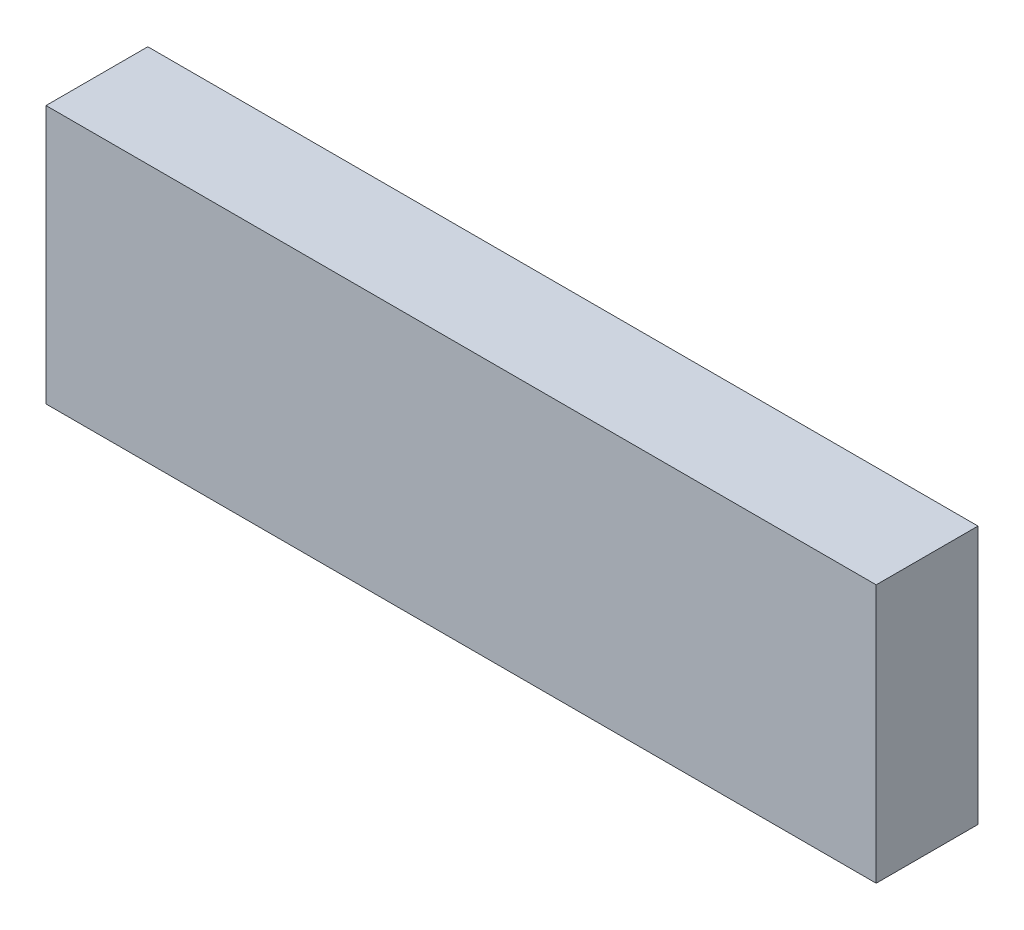
ISO-10303-21;
HEADER;
FILE_DESCRIPTION(('STEP AP214'),'2;1');
FILE_NAME('part.step','',(''),(''),'','','');
FILE_SCHEMA(('AUTOMOTIVE_DESIGN { 1 0 10303 214 1 1 1 1 }'));
ENDSEC;
DATA;
#1=APPLICATION_CONTEXT('core data for automotive mechanical design processes');
#2=APPLICATION_PROTOCOL_DEFINITION('international standard','automotive_design',2000,#1);
#3=PRODUCT_CONTEXT('',#1,'mechanical');
#4=PRODUCT('Part','Part','',(#3));
#5=PRODUCT_RELATED_PRODUCT_CATEGORY('part','',(#4));
#6=PRODUCT_DEFINITION_FORMATION('','',#4);
#7=PRODUCT_DEFINITION_CONTEXT('part definition',#1,'design');
#8=PRODUCT_DEFINITION('design','',#6,#7);
#9=PRODUCT_DEFINITION_SHAPE('','',#8);
#10=(LENGTH_UNIT() NAMED_UNIT(*) SI_UNIT(.MILLI.,.METRE.));
#11=(NAMED_UNIT(*) PLANE_ANGLE_UNIT() SI_UNIT($,.RADIAN.));
#12=(NAMED_UNIT(*) SI_UNIT($,.STERADIAN.) SOLID_ANGLE_UNIT());
#13=UNCERTAINTY_MEASURE_WITH_UNIT(LENGTH_MEASURE(1.E-05),#10,'distance_accuracy_value','');
#14=(GEOMETRIC_REPRESENTATION_CONTEXT(3) GLOBAL_UNCERTAINTY_ASSIGNED_CONTEXT((#13)) GLOBAL_UNIT_ASSIGNED_CONTEXT((#10,
#11,#12)) REPRESENTATION_CONTEXT('',''));
#15=CARTESIAN_POINT('',(0.,0.,0.));
#16=DIRECTION('',(0.,0.,1.));
#17=DIRECTION('',(1.,0.,0.));
#18=AXIS2_PLACEMENT_3D('',#15,#16,#17);
#19=CARTESIAN_POINT('',(0.,33.,0.));
#20=DIRECTION('',(1.,0.,0.));
#21=DIRECTION('',(0.,0.,-1.));
#22=AXIS2_PLACEMENT_3D('',#19,#20,#21);
#23=PLANE('',#22);
#24=DIRECTION('',(0.,0.,1.));
#25=VECTOR('',#24,1.);
#26=CARTESIAN_POINT('',(0.,0.,0.));
#27=LINE('',#26,#25);
#28=CARTESIAN_POINT('',(0.,0.,-13.));
#29=VERTEX_POINT('',#28);
#30=CARTESIAN_POINT('',(0.,0.,0.));
#31=VERTEX_POINT('',#30);
#32=EDGE_CURVE('E96',#29,#31,#27,.T.);
#33=ORIENTED_EDGE('',*,*,#32,.T.);
#34=DIRECTION('',(0.,-1.,0.));
#35=VECTOR('',#34,1.);
#36=CARTESIAN_POINT('',(0.,33.,0.));
#37=LINE('',#36,#35);
#38=CARTESIAN_POINT('',(0.,33.,0.));
#39=VERTEX_POINT('',#38);
#40=EDGE_CURVE('E11',#39,#31,#37,.T.);
#41=ORIENTED_EDGE('',*,*,#40,.F.);
#42=DIRECTION('',(0.,0.,1.));
#43=VECTOR('',#42,1.);
#44=CARTESIAN_POINT('',(0.,33.,0.));
#45=LINE('',#44,#43);
#46=CARTESIAN_POINT('',(0.,33.,-13.));
#47=VERTEX_POINT('',#46);
#48=EDGE_CURVE('E84',#47,#39,#45,.T.);
#49=ORIENTED_EDGE('',*,*,#48,.F.);
#50=DIRECTION('',(0.,-1.,0.));
#51=VECTOR('',#50,1.);
#52=CARTESIAN_POINT('',(0.,33.,-13.));
#53=LINE('',#52,#51);
#54=EDGE_CURVE('E92',#47,#29,#53,.T.);
#55=ORIENTED_EDGE('',*,*,#54,.T.);
#56=EDGE_LOOP('',(#33,#41,#49,#55));
#57=FACE_BOUND('',#56,.T.);
#58=ADVANCED_FACE('F33',(#57),#23,.F.);
#59=CARTESIAN_POINT('',(0.,33.,0.));
#60=DIRECTION('',(0.,0.,-1.));
#61=DIRECTION('',(-1.,0.,0.));
#62=AXIS2_PLACEMENT_3D('',#59,#60,#61);
#63=PLANE('',#62);
#64=DIRECTION('',(1.,0.,0.));
#65=VECTOR('',#64,1.);
#66=CARTESIAN_POINT('',(0.,0.,0.));
#67=LINE('',#66,#65);
#68=CARTESIAN_POINT('',(106.,0.,0.));
#69=VERTEX_POINT('',#68);
#70=EDGE_CURVE('E88',#31,#69,#67,.T.);
#71=ORIENTED_EDGE('',*,*,#70,.T.);
#72=DIRECTION('',(0.,-1.,0.));
#73=VECTOR('',#72,1.);
#74=CARTESIAN_POINT('',(106.,33.,0.));
#75=LINE('',#74,#73);
#76=CARTESIAN_POINT('',(106.,33.,0.));
#77=VERTEX_POINT('',#76);
#78=EDGE_CURVE('E41',#77,#69,#75,.T.);
#79=ORIENTED_EDGE('',*,*,#78,.F.);
#80=DIRECTION('',(1.,0.,0.));
#81=VECTOR('',#80,1.);
#82=CARTESIAN_POINT('',(0.,33.,0.));
#83=LINE('',#82,#81);
#84=EDGE_CURVE('E79',#39,#77,#83,.T.);
#85=ORIENTED_EDGE('',*,*,#84,.F.);
#86=ORIENTED_EDGE('',*,*,#40,.T.);
#87=EDGE_LOOP('',(#71,#79,#85,#86));
#88=FACE_BOUND('',#87,.T.);
#89=ADVANCED_FACE('F87',(#88),#63,.F.);
#90=CARTESIAN_POINT('',(106.,33.,0.));
#91=DIRECTION('',(-1.,0.,0.));
#92=DIRECTION('',(0.,0.,1.));
#93=AXIS2_PLACEMENT_3D('',#90,#91,#92);
#94=PLANE('',#93);
#95=DIRECTION('',(0.,0.,-1.));
#96=VECTOR('',#95,1.);
#97=CARTESIAN_POINT('',(106.,0.,0.));
#98=LINE('',#97,#96);
#99=CARTESIAN_POINT('',(106.,0.,-13.));
#100=VERTEX_POINT('',#99);
#101=EDGE_CURVE('E66',#69,#100,#98,.T.);
#102=ORIENTED_EDGE('',*,*,#101,.T.);
#103=DIRECTION('',(0.,-1.,0.));
#104=VECTOR('',#103,1.);
#105=CARTESIAN_POINT('',(106.,33.,-13.));
#106=LINE('',#105,#104);
#107=CARTESIAN_POINT('',(106.,33.,-13.));
#108=VERTEX_POINT('',#107);
#109=EDGE_CURVE('E89',#108,#100,#106,.T.);
#110=ORIENTED_EDGE('',*,*,#109,.F.);
#111=DIRECTION('',(0.,0.,-1.));
#112=VECTOR('',#111,1.);
#113=CARTESIAN_POINT('',(106.,33.,0.));
#114=LINE('',#113,#112);
#115=EDGE_CURVE('E82',#77,#108,#114,.T.);
#116=ORIENTED_EDGE('',*,*,#115,.F.);
#117=ORIENTED_EDGE('',*,*,#78,.T.);
#118=EDGE_LOOP('',(#102,#110,#116,#117));
#119=FACE_BOUND('',#118,.T.);
#120=ADVANCED_FACE('F90',(#119),#94,.F.);
#121=CARTESIAN_POINT('',(0.,33.,-13.));
#122=DIRECTION('',(0.,0.,1.));
#123=DIRECTION('',(1.,0.,0.));
#124=AXIS2_PLACEMENT_3D('',#121,#122,#123);
#125=PLANE('',#124);
#126=DIRECTION('',(-1.,0.,0.));
#127=VECTOR('',#126,1.);
#128=CARTESIAN_POINT('',(0.,0.,-13.));
#129=LINE('',#128,#127);
#130=EDGE_CURVE('E72',#100,#29,#129,.T.);
#131=ORIENTED_EDGE('',*,*,#130,.T.);
#132=ORIENTED_EDGE('',*,*,#54,.F.);
#133=DIRECTION('',(-1.,0.,0.));
#134=VECTOR('',#133,1.);
#135=CARTESIAN_POINT('',(0.,33.,-13.));
#136=LINE('',#135,#134);
#137=EDGE_CURVE('E49',#108,#47,#136,.T.);
#138=ORIENTED_EDGE('',*,*,#137,.F.);
#139=ORIENTED_EDGE('',*,*,#109,.T.);
#140=EDGE_LOOP('',(#131,#132,#138,#139));
#141=FACE_BOUND('',#140,.T.);
#142=ADVANCED_FACE('F103',(#141),#125,.F.);
#143=CARTESIAN_POINT('',(0.,33.,0.));
#144=DIRECTION('',(0.,-1.,0.));
#145=DIRECTION('',(0.,0.,-1.));
#146=AXIS2_PLACEMENT_3D('',#143,#144,#145);
#147=PLANE('',#146);
#148=ORIENTED_EDGE('',*,*,#48,.T.);
#149=ORIENTED_EDGE('',*,*,#84,.T.);
#150=ORIENTED_EDGE('',*,*,#115,.T.);
#151=ORIENTED_EDGE('',*,*,#137,.T.);
#152=EDGE_LOOP('',(#148,#149,#150,#151));
#153=FACE_BOUND('',#152,.T.);
#154=ADVANCED_FACE('F80',(#153),#147,.F.);
#155=CARTESIAN_POINT('',(0.,0.,0.));
#156=DIRECTION('',(0.,-1.,0.));
#157=DIRECTION('',(0.,0.,-1.));
#158=AXIS2_PLACEMENT_3D('',#155,#156,#157);
#159=PLANE('',#158);
#160=ORIENTED_EDGE('',*,*,#32,.F.);
#161=ORIENTED_EDGE('',*,*,#130,.F.);
#162=ORIENTED_EDGE('',*,*,#101,.F.);
#163=ORIENTED_EDGE('',*,*,#70,.F.);
#164=EDGE_LOOP('',(#160,#161,#162,#163));
#165=FACE_BOUND('',#164,.T.);
#166=ADVANCED_FACE('F106',(#165),#159,.T.);
#167=CLOSED_SHELL('',(#58,#89,#120,#142,#154,#166));
#168=MANIFOLD_SOLID_BREP('B2',#167);
#169=ADVANCED_BREP_SHAPE_REPRESENTATION('',(#18,#168),#14);
#170=SHAPE_DEFINITION_REPRESENTATION(#9,#169);
ENDSEC;
END-ISO-10303-21;
